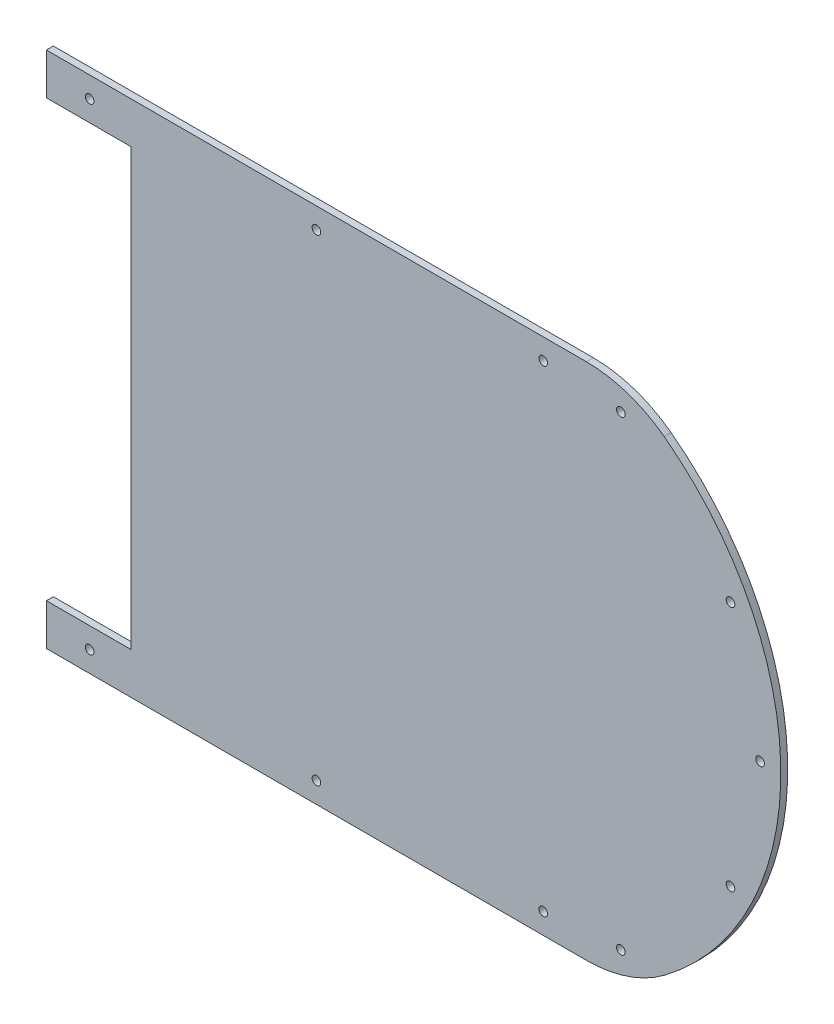
ISO-10303-21;
HEADER;
FILE_DESCRIPTION(('STEP AP214'),'2;1');
FILE_NAME('part.step','',(''),(''),'','','');
FILE_SCHEMA(('AUTOMOTIVE_DESIGN { 1 0 10303 214 1 1 1 1 }'));
ENDSEC;
DATA;
#1=APPLICATION_CONTEXT('core data for automotive mechanical design processes');
#2=APPLICATION_PROTOCOL_DEFINITION('international standard','automotive_design',2000,#1);
#3=PRODUCT_CONTEXT('',#1,'mechanical');
#4=PRODUCT('Part','Part','',(#3));
#5=PRODUCT_RELATED_PRODUCT_CATEGORY('part','',(#4));
#6=PRODUCT_DEFINITION_FORMATION('','',#4);
#7=PRODUCT_DEFINITION_CONTEXT('part definition',#1,'design');
#8=PRODUCT_DEFINITION('design','',#6,#7);
#9=PRODUCT_DEFINITION_SHAPE('','',#8);
#10=(LENGTH_UNIT() NAMED_UNIT(*) SI_UNIT(.MILLI.,.METRE.));
#11=(NAMED_UNIT(*) PLANE_ANGLE_UNIT() SI_UNIT($,.RADIAN.));
#12=(NAMED_UNIT(*) SI_UNIT($,.STERADIAN.) SOLID_ANGLE_UNIT());
#13=UNCERTAINTY_MEASURE_WITH_UNIT(LENGTH_MEASURE(1.E-05),#10,'distance_accuracy_value','');
#14=(GEOMETRIC_REPRESENTATION_CONTEXT(3) GLOBAL_UNCERTAINTY_ASSIGNED_CONTEXT((#13)) GLOBAL_UNIT_ASSIGNED_CONTEXT((#10,
#11,#12)) REPRESENTATION_CONTEXT('',''));
#15=CARTESIAN_POINT('',(0.,0.,0.));
#16=DIRECTION('',(0.,0.,1.));
#17=DIRECTION('',(1.,0.,0.));
#18=AXIS2_PLACEMENT_3D('',#15,#16,#17);
#19=CARTESIAN_POINT('',(312.5,102.525252525253,4.));
#20=DIRECTION('',(0.,0.,1.));
#21=DIRECTION('',(1.,0.,0.));
#22=AXIS2_PLACEMENT_3D('',#19,#20,#21);
#23=PLANE('',#22);
#24=CARTESIAN_POINT('',(156.25,-110.474747474747,4.));
#25=DIRECTION('',(0.,0.,1.));
#26=DIRECTION('',(1.,0.,0.));
#27=AXIS2_PLACEMENT_3D('',#24,#25,#26);
#28=CIRCLE('',#27,2.5);
#29=CARTESIAN_POINT('',(158.75,-110.474747474747,4.));
#30=VERTEX_POINT('',#29);
#31=EDGE_CURVE('E261',#30,#30,#28,.T.);
#32=ORIENTED_EDGE('',*,*,#31,.F.);
#33=EDGE_LOOP('',(#32));
#34=FACE_BOUND('',#33,.T.);
#35=CARTESIAN_POINT('',(332.422349259061,-107.24179525193,4.));
#36=DIRECTION('',(0.,0.,1.));
#37=DIRECTION('',(1.,0.,0.));
#38=AXIS2_PLACEMENT_3D('',#35,#36,#37);
#39=CIRCLE('',#38,2.50000000000002);
#40=CARTESIAN_POINT('',(334.922349259061,-107.24179525193,4.));
#41=VERTEX_POINT('',#40);
#42=EDGE_CURVE('E249',#41,#41,#39,.T.);
#43=ORIENTED_EDGE('',*,*,#42,.F.);
#44=EDGE_LOOP('',(#43));
#45=FACE_BOUND('',#44,.T.);
#46=CARTESIAN_POINT('',(395.887987253219,-43.6912835872944,4.));
#47=DIRECTION('',(0.,0.,1.));
#48=DIRECTION('',(1.,0.,0.));
#49=AXIS2_PLACEMENT_3D('',#46,#47,#48);
#50=CIRCLE('',#49,2.50000000000002);
#51=CARTESIAN_POINT('',(398.387987253219,-43.6912835872944,4.));
#52=VERTEX_POINT('',#51);
#53=EDGE_CURVE('E237',#52,#52,#50,.T.);
#54=ORIENTED_EDGE('',*,*,#53,.F.);
#55=EDGE_LOOP('',(#54));
#56=FACE_BOUND('',#55,.T.);
#57=CARTESIAN_POINT('',(395.887987253219,98.7417886377996,4.));
#58=DIRECTION('',(0.,0.,1.));
#59=DIRECTION('',(1.,0.,0.));
#60=AXIS2_PLACEMENT_3D('',#57,#58,#59);
#61=CIRCLE('',#60,2.50000000000002);
#62=CARTESIAN_POINT('',(398.387987253219,98.7417886377996,4.));
#63=VERTEX_POINT('',#62);
#64=EDGE_CURVE('E225',#63,#63,#61,.T.);
#65=ORIENTED_EDGE('',*,*,#64,.F.);
#66=EDGE_LOOP('',(#65));
#67=FACE_BOUND('',#66,.T.);
#68=CARTESIAN_POINT('',(287.5,165.525252525252,4.));
#69=DIRECTION('',(0.,0.,1.));
#70=DIRECTION('',(1.,0.,0.));
#71=AXIS2_PLACEMENT_3D('',#68,#69,#70);
#72=CIRCLE('',#71,2.50000000000002);
#73=CARTESIAN_POINT('',(290.,165.525252525252,4.));
#74=VERTEX_POINT('',#73);
#75=EDGE_CURVE('E213',#74,#74,#72,.T.);
#76=ORIENTED_EDGE('',*,*,#75,.F.);
#77=EDGE_LOOP('',(#76));
#78=FACE_BOUND('',#77,.T.);
#79=DIRECTION('',(-1.,0.,0.));
#80=VECTOR('',#79,1.);
#81=CARTESIAN_POINT('',(0.,-98.4747474747475,4.));
#82=LINE('',#81,#80);
#83=CARTESIAN_POINT('',(49.,-98.4747474747475,4.));
#84=VERTEX_POINT('',#83);
#85=CARTESIAN_POINT('',(0.,-98.4747474747475,4.));
#86=VERTEX_POINT('',#85);
#87=EDGE_CURVE('E162',#84,#86,#82,.T.);
#88=ORIENTED_EDGE('',*,*,#87,.T.);
#89=DIRECTION('',(0.,-1.,0.));
#90=VECTOR('',#89,1.);
#91=CARTESIAN_POINT('',(0.,-98.4747474747475,4.));
#92=LINE('',#91,#90);
#93=CARTESIAN_POINT('',(0.,-122.474747474747,4.));
#94=VERTEX_POINT('',#93);
#95=EDGE_CURVE('E100',#86,#94,#92,.T.);
#96=ORIENTED_EDGE('',*,*,#95,.T.);
#97=DIRECTION('',(1.,0.,0.));
#98=VECTOR('',#97,1.);
#99=CARTESIAN_POINT('',(0.,-122.474747474747,4.));
#100=LINE('',#99,#98);
#101=CARTESIAN_POINT('',(312.5,-122.474747474747,4.));
#102=VERTEX_POINT('',#101);
#103=EDGE_CURVE('E183',#94,#102,#100,.T.);
#104=ORIENTED_EDGE('',*,*,#103,.T.);
#105=CARTESIAN_POINT('',(312.5,-47.4747474747475,4.));
#106=DIRECTION('',(0.,0.,1.));
#107=DIRECTION('',(1.,0.,0.));
#108=AXIS2_PLACEMENT_3D('',#105,#106,#107);
#109=CIRCLE('',#108,75.);
#110=CARTESIAN_POINT('',(357.5,-107.474747474747,4.));
#111=VERTEX_POINT('',#110);
#112=EDGE_CURVE('E202',#102,#111,#109,.T.);
#113=ORIENTED_EDGE('',*,*,#112,.T.);
#114=CARTESIAN_POINT('',(256.25,27.5252525252525,4.));
#115=DIRECTION('',(0.,0.,1.));
#116=DIRECTION('',(1.,0.,0.));
#117=AXIS2_PLACEMENT_3D('',#114,#115,#116);
#118=CIRCLE('',#117,168.75);
#119=CARTESIAN_POINT('',(357.5,162.525252525253,4.));
#120=VERTEX_POINT('',#119);
#121=EDGE_CURVE('E199',#111,#120,#118,.T.);
#122=ORIENTED_EDGE('',*,*,#121,.T.);
#123=CARTESIAN_POINT('',(312.5,102.525252525253,4.));
#124=DIRECTION('',(0.,0.,1.));
#125=DIRECTION('',(1.,0.,0.));
#126=AXIS2_PLACEMENT_3D('',#123,#124,#125);
#127=CIRCLE('',#126,75.);
#128=CARTESIAN_POINT('',(312.5,177.525252525252,4.));
#129=VERTEX_POINT('',#128);
#130=EDGE_CURVE('E201',#120,#129,#127,.T.);
#131=ORIENTED_EDGE('',*,*,#130,.T.);
#132=DIRECTION('',(-1.,0.,0.));
#133=VECTOR('',#132,1.);
#134=CARTESIAN_POINT('',(312.5,177.525252525252,4.));
#135=LINE('',#134,#133);
#136=CARTESIAN_POINT('',(0.,177.525252525253,4.));
#137=VERTEX_POINT('',#136);
#138=EDGE_CURVE('E125',#129,#137,#135,.T.);
#139=ORIENTED_EDGE('',*,*,#138,.T.);
#140=DIRECTION('',(0.,-1.,0.));
#141=VECTOR('',#140,1.);
#142=CARTESIAN_POINT('',(0.,177.525252525253,4.));
#143=LINE('',#142,#141);
#144=CARTESIAN_POINT('',(0.,153.525252525253,4.));
#145=VERTEX_POINT('',#144);
#146=EDGE_CURVE('E119',#137,#145,#143,.T.);
#147=ORIENTED_EDGE('',*,*,#146,.T.);
#148=DIRECTION('',(1.,0.,0.));
#149=VECTOR('',#148,1.);
#150=CARTESIAN_POINT('',(49.,153.525252525253,4.));
#151=LINE('',#150,#149);
#152=CARTESIAN_POINT('',(49.,153.525252525253,4.));
#153=VERTEX_POINT('',#152);
#154=EDGE_CURVE('E123',#145,#153,#151,.T.);
#155=ORIENTED_EDGE('',*,*,#154,.T.);
#156=DIRECTION('',(0.,-1.,0.));
#157=VECTOR('',#156,1.);
#158=CARTESIAN_POINT('',(49.,153.525252525253,4.));
#159=LINE('',#158,#157);
#160=EDGE_CURVE('E51',#153,#84,#159,.T.);
#161=ORIENTED_EDGE('',*,*,#160,.T.);
#162=EDGE_LOOP('',(#88,#96,#104,#113,#122,#131,#139,#147,#155,#161));
#163=FACE_BOUND('',#162,.T.);
#164=CARTESIAN_POINT('',(156.25,165.525252525253,4.));
#165=DIRECTION('',(0.,0.,1.));
#166=DIRECTION('',(1.,0.,0.));
#167=AXIS2_PLACEMENT_3D('',#164,#165,#166);
#168=CIRCLE('',#167,2.5);
#169=CARTESIAN_POINT('',(158.75,165.525252525253,4.));
#170=VERTEX_POINT('',#169);
#171=EDGE_CURVE('E147',#170,#170,#168,.T.);
#172=ORIENTED_EDGE('',*,*,#171,.F.);
#173=EDGE_LOOP('',(#172));
#174=FACE_BOUND('',#173,.T.);
#175=CARTESIAN_POINT('',(332.422349259061,162.292300302435,4.));
#176=DIRECTION('',(0.,0.,1.));
#177=DIRECTION('',(1.,0.,0.));
#178=AXIS2_PLACEMENT_3D('',#175,#176,#177);
#179=CIRCLE('',#178,2.50000000000002);
#180=CARTESIAN_POINT('',(334.922349259061,162.292300302435,4.));
#181=VERTEX_POINT('',#180);
#182=EDGE_CURVE('E219',#181,#181,#179,.T.);
#183=ORIENTED_EDGE('',*,*,#182,.F.);
#184=EDGE_LOOP('',(#183));
#185=FACE_BOUND('',#184,.T.);
#186=CARTESIAN_POINT('',(413.,27.5252525252525,4.));
#187=DIRECTION('',(0.,0.,1.));
#188=DIRECTION('',(1.,0.,0.));
#189=AXIS2_PLACEMENT_3D('',#186,#187,#188);
#190=CIRCLE('',#189,2.50000000000002);
#191=CARTESIAN_POINT('',(415.5,27.5252525252525,4.));
#192=VERTEX_POINT('',#191);
#193=EDGE_CURVE('E231',#192,#192,#190,.T.);
#194=ORIENTED_EDGE('',*,*,#193,.F.);
#195=EDGE_LOOP('',(#194));
#196=FACE_BOUND('',#195,.T.);
#197=CARTESIAN_POINT('',(25.,165.525252525252,4.));
#198=DIRECTION('',(0.,0.,1.));
#199=DIRECTION('',(1.,0.,0.));
#200=AXIS2_PLACEMENT_3D('',#197,#198,#199);
#201=CIRCLE('',#200,2.5);
#202=CARTESIAN_POINT('',(27.5,165.525252525252,4.));
#203=VERTEX_POINT('',#202);
#204=EDGE_CURVE('E243',#203,#203,#201,.T.);
#205=ORIENTED_EDGE('',*,*,#204,.F.);
#206=EDGE_LOOP('',(#205));
#207=FACE_BOUND('',#206,.T.);
#208=CARTESIAN_POINT('',(287.5,-110.474747474747,4.));
#209=DIRECTION('',(0.,0.,1.));
#210=DIRECTION('',(1.,0.,0.));
#211=AXIS2_PLACEMENT_3D('',#208,#209,#210);
#212=CIRCLE('',#211,2.50000000000002);
#213=CARTESIAN_POINT('',(290.,-110.474747474747,4.));
#214=VERTEX_POINT('',#213);
#215=EDGE_CURVE('E255',#214,#214,#212,.T.);
#216=ORIENTED_EDGE('',*,*,#215,.F.);
#217=EDGE_LOOP('',(#216));
#218=FACE_BOUND('',#217,.T.);
#219=CARTESIAN_POINT('',(25.,-110.474747474747,4.));
#220=DIRECTION('',(0.,0.,1.));
#221=DIRECTION('',(1.,0.,0.));
#222=AXIS2_PLACEMENT_3D('',#219,#220,#221);
#223=CIRCLE('',#222,2.5);
#224=CARTESIAN_POINT('',(27.5,-110.474747474747,4.));
#225=VERTEX_POINT('',#224);
#226=EDGE_CURVE('E267',#225,#225,#223,.T.);
#227=ORIENTED_EDGE('',*,*,#226,.F.);
#228=EDGE_LOOP('',(#227));
#229=FACE_BOUND('',#228,.T.);
#230=ADVANCED_FACE('F34',(#34,#45,#56,#67,#78,#163,#174,#185,#196,#207,#218,#229),#23,.T.);
#231=CARTESIAN_POINT('',(312.5,102.525252525253,0.));
#232=DIRECTION('',(0.,0.,1.));
#233=DIRECTION('',(1.,0.,0.));
#234=AXIS2_PLACEMENT_3D('',#231,#232,#233);
#235=PLANE('',#234);
#236=DIRECTION('',(-1.,0.,0.));
#237=VECTOR('',#236,1.);
#238=CARTESIAN_POINT('',(0.,-98.4747474747475,0.));
#239=LINE('',#238,#237);
#240=CARTESIAN_POINT('',(49.,-98.4747474747475,0.));
#241=VERTEX_POINT('',#240);
#242=CARTESIAN_POINT('',(0.,-98.4747474747475,0.));
#243=VERTEX_POINT('',#242);
#244=EDGE_CURVE('E143',#241,#243,#239,.T.);
#245=ORIENTED_EDGE('',*,*,#244,.F.);
#246=DIRECTION('',(0.,-1.,0.));
#247=VECTOR('',#246,1.);
#248=CARTESIAN_POINT('',(49.,153.525252525253,0.));
#249=LINE('',#248,#247);
#250=CARTESIAN_POINT('',(49.,153.525252525253,0.));
#251=VERTEX_POINT('',#250);
#252=EDGE_CURVE('E92',#251,#241,#249,.T.);
#253=ORIENTED_EDGE('',*,*,#252,.F.);
#254=DIRECTION('',(1.,0.,0.));
#255=VECTOR('',#254,1.);
#256=CARTESIAN_POINT('',(49.,153.525252525253,0.));
#257=LINE('',#256,#255);
#258=CARTESIAN_POINT('',(0.,153.525252525253,0.));
#259=VERTEX_POINT('',#258);
#260=EDGE_CURVE('E86',#259,#251,#257,.T.);
#261=ORIENTED_EDGE('',*,*,#260,.F.);
#262=DIRECTION('',(0.,-1.,0.));
#263=VECTOR('',#262,1.);
#264=CARTESIAN_POINT('',(0.,177.525252525253,0.));
#265=LINE('',#264,#263);
#266=CARTESIAN_POINT('',(0.,177.525252525253,0.));
#267=VERTEX_POINT('',#266);
#268=EDGE_CURVE('E133',#267,#259,#265,.T.);
#269=ORIENTED_EDGE('',*,*,#268,.F.);
#270=DIRECTION('',(-1.,0.,0.));
#271=VECTOR('',#270,1.);
#272=CARTESIAN_POINT('',(312.5,177.525252525252,0.));
#273=LINE('',#272,#271);
#274=CARTESIAN_POINT('',(312.5,177.525252525252,0.));
#275=VERTEX_POINT('',#274);
#276=EDGE_CURVE('E157',#275,#267,#273,.T.);
#277=ORIENTED_EDGE('',*,*,#276,.F.);
#278=CARTESIAN_POINT('',(312.5,102.525252525253,0.));
#279=DIRECTION('',(0.,0.,1.));
#280=DIRECTION('',(1.,0.,0.));
#281=AXIS2_PLACEMENT_3D('',#278,#279,#280);
#282=CIRCLE('',#281,75.);
#283=CARTESIAN_POINT('',(357.5,162.525252525253,0.));
#284=VERTEX_POINT('',#283);
#285=EDGE_CURVE('E155',#284,#275,#282,.T.);
#286=ORIENTED_EDGE('',*,*,#285,.F.);
#287=CARTESIAN_POINT('',(256.25,27.5252525252525,0.));
#288=DIRECTION('',(0.,0.,1.));
#289=DIRECTION('',(1.,0.,0.));
#290=AXIS2_PLACEMENT_3D('',#287,#288,#289);
#291=CIRCLE('',#290,168.75);
#292=CARTESIAN_POINT('',(357.5,-107.474747474747,0.));
#293=VERTEX_POINT('',#292);
#294=EDGE_CURVE('E153',#293,#284,#291,.T.);
#295=ORIENTED_EDGE('',*,*,#294,.F.);
#296=CARTESIAN_POINT('',(312.5,-47.4747474747475,0.));
#297=DIRECTION('',(0.,0.,1.));
#298=DIRECTION('',(1.,0.,0.));
#299=AXIS2_PLACEMENT_3D('',#296,#297,#298);
#300=CIRCLE('',#299,75.);
#301=CARTESIAN_POINT('',(312.5,-122.474747474747,0.));
#302=VERTEX_POINT('',#301);
#303=EDGE_CURVE('E151',#302,#293,#300,.T.);
#304=ORIENTED_EDGE('',*,*,#303,.F.);
#305=DIRECTION('',(1.,0.,0.));
#306=VECTOR('',#305,1.);
#307=CARTESIAN_POINT('',(0.,-122.474747474747,0.));
#308=LINE('',#307,#306);
#309=CARTESIAN_POINT('',(0.,-122.474747474747,0.));
#310=VERTEX_POINT('',#309);
#311=EDGE_CURVE('E149',#310,#302,#308,.T.);
#312=ORIENTED_EDGE('',*,*,#311,.F.);
#313=DIRECTION('',(0.,-1.,0.));
#314=VECTOR('',#313,1.);
#315=CARTESIAN_POINT('',(0.,-98.4747474747475,0.));
#316=LINE('',#315,#314);
#317=EDGE_CURVE('E146',#243,#310,#316,.T.);
#318=ORIENTED_EDGE('',*,*,#317,.F.);
#319=EDGE_LOOP('',(#245,#253,#261,#269,#277,#286,#295,#304,#312,#318));
#320=FACE_BOUND('',#319,.T.);
#321=CARTESIAN_POINT('',(156.25,165.525252525253,0.));
#322=DIRECTION('',(0.,0.,1.));
#323=DIRECTION('',(1.,0.,0.));
#324=AXIS2_PLACEMENT_3D('',#321,#322,#323);
#325=CIRCLE('',#324,2.5);
#326=CARTESIAN_POINT('',(158.75,165.525252525253,0.));
#327=VERTEX_POINT('',#326);
#328=EDGE_CURVE('E210',#327,#327,#325,.T.);
#329=ORIENTED_EDGE('',*,*,#328,.T.);
#330=EDGE_LOOP('',(#329));
#331=FACE_BOUND('',#330,.T.);
#332=CARTESIAN_POINT('',(287.5,165.525252525252,0.));
#333=DIRECTION('',(0.,0.,1.));
#334=DIRECTION('',(1.,0.,0.));
#335=AXIS2_PLACEMENT_3D('',#332,#333,#334);
#336=CIRCLE('',#335,2.50000000000002);
#337=CARTESIAN_POINT('',(290.,165.525252525252,0.));
#338=VERTEX_POINT('',#337);
#339=EDGE_CURVE('E216',#338,#338,#336,.T.);
#340=ORIENTED_EDGE('',*,*,#339,.T.);
#341=EDGE_LOOP('',(#340));
#342=FACE_BOUND('',#341,.T.);
#343=CARTESIAN_POINT('',(332.422349259061,162.292300302435,0.));
#344=DIRECTION('',(0.,0.,1.));
#345=DIRECTION('',(1.,0.,0.));
#346=AXIS2_PLACEMENT_3D('',#343,#344,#345);
#347=CIRCLE('',#346,2.50000000000002);
#348=CARTESIAN_POINT('',(334.922349259061,162.292300302435,0.));
#349=VERTEX_POINT('',#348);
#350=EDGE_CURVE('E222',#349,#349,#347,.T.);
#351=ORIENTED_EDGE('',*,*,#350,.T.);
#352=EDGE_LOOP('',(#351));
#353=FACE_BOUND('',#352,.T.);
#354=CARTESIAN_POINT('',(395.887987253219,98.7417886377996,0.));
#355=DIRECTION('',(0.,0.,1.));
#356=DIRECTION('',(1.,0.,0.));
#357=AXIS2_PLACEMENT_3D('',#354,#355,#356);
#358=CIRCLE('',#357,2.50000000000002);
#359=CARTESIAN_POINT('',(398.387987253219,98.7417886377996,0.));
#360=VERTEX_POINT('',#359);
#361=EDGE_CURVE('E228',#360,#360,#358,.T.);
#362=ORIENTED_EDGE('',*,*,#361,.T.);
#363=EDGE_LOOP('',(#362));
#364=FACE_BOUND('',#363,.T.);
#365=CARTESIAN_POINT('',(413.,27.5252525252525,0.));
#366=DIRECTION('',(0.,0.,1.));
#367=DIRECTION('',(1.,0.,0.));
#368=AXIS2_PLACEMENT_3D('',#365,#366,#367);
#369=CIRCLE('',#368,2.50000000000002);
#370=CARTESIAN_POINT('',(415.5,27.5252525252525,0.));
#371=VERTEX_POINT('',#370);
#372=EDGE_CURVE('E234',#371,#371,#369,.T.);
#373=ORIENTED_EDGE('',*,*,#372,.T.);
#374=EDGE_LOOP('',(#373));
#375=FACE_BOUND('',#374,.T.);
#376=CARTESIAN_POINT('',(395.887987253219,-43.6912835872944,0.));
#377=DIRECTION('',(0.,0.,1.));
#378=DIRECTION('',(1.,0.,0.));
#379=AXIS2_PLACEMENT_3D('',#376,#377,#378);
#380=CIRCLE('',#379,2.50000000000002);
#381=CARTESIAN_POINT('',(398.387987253219,-43.6912835872944,0.));
#382=VERTEX_POINT('',#381);
#383=EDGE_CURVE('E240',#382,#382,#380,.T.);
#384=ORIENTED_EDGE('',*,*,#383,.T.);
#385=EDGE_LOOP('',(#384));
#386=FACE_BOUND('',#385,.T.);
#387=CARTESIAN_POINT('',(25.,165.525252525252,0.));
#388=DIRECTION('',(0.,0.,1.));
#389=DIRECTION('',(1.,0.,0.));
#390=AXIS2_PLACEMENT_3D('',#387,#388,#389);
#391=CIRCLE('',#390,2.5);
#392=CARTESIAN_POINT('',(27.5,165.525252525252,0.));
#393=VERTEX_POINT('',#392);
#394=EDGE_CURVE('E246',#393,#393,#391,.T.);
#395=ORIENTED_EDGE('',*,*,#394,.T.);
#396=EDGE_LOOP('',(#395));
#397=FACE_BOUND('',#396,.T.);
#398=CARTESIAN_POINT('',(332.422349259061,-107.24179525193,0.));
#399=DIRECTION('',(0.,0.,1.));
#400=DIRECTION('',(1.,0.,0.));
#401=AXIS2_PLACEMENT_3D('',#398,#399,#400);
#402=CIRCLE('',#401,2.50000000000002);
#403=CARTESIAN_POINT('',(334.922349259061,-107.24179525193,0.));
#404=VERTEX_POINT('',#403);
#405=EDGE_CURVE('E252',#404,#404,#402,.T.);
#406=ORIENTED_EDGE('',*,*,#405,.T.);
#407=EDGE_LOOP('',(#406));
#408=FACE_BOUND('',#407,.T.);
#409=CARTESIAN_POINT('',(287.5,-110.474747474747,0.));
#410=DIRECTION('',(0.,0.,1.));
#411=DIRECTION('',(1.,0.,0.));
#412=AXIS2_PLACEMENT_3D('',#409,#410,#411);
#413=CIRCLE('',#412,2.50000000000002);
#414=CARTESIAN_POINT('',(290.,-110.474747474747,0.));
#415=VERTEX_POINT('',#414);
#416=EDGE_CURVE('E258',#415,#415,#413,.T.);
#417=ORIENTED_EDGE('',*,*,#416,.T.);
#418=EDGE_LOOP('',(#417));
#419=FACE_BOUND('',#418,.T.);
#420=CARTESIAN_POINT('',(156.25,-110.474747474747,0.));
#421=DIRECTION('',(0.,0.,1.));
#422=DIRECTION('',(1.,0.,0.));
#423=AXIS2_PLACEMENT_3D('',#420,#421,#422);
#424=CIRCLE('',#423,2.5);
#425=CARTESIAN_POINT('',(158.75,-110.474747474747,0.));
#426=VERTEX_POINT('',#425);
#427=EDGE_CURVE('E264',#426,#426,#424,.T.);
#428=ORIENTED_EDGE('',*,*,#427,.T.);
#429=EDGE_LOOP('',(#428));
#430=FACE_BOUND('',#429,.T.);
#431=CARTESIAN_POINT('',(25.,-110.474747474747,0.));
#432=DIRECTION('',(0.,0.,1.));
#433=DIRECTION('',(1.,0.,0.));
#434=AXIS2_PLACEMENT_3D('',#431,#432,#433);
#435=CIRCLE('',#434,2.5);
#436=CARTESIAN_POINT('',(27.5,-110.474747474747,0.));
#437=VERTEX_POINT('',#436);
#438=EDGE_CURVE('E270',#437,#437,#435,.T.);
#439=ORIENTED_EDGE('',*,*,#438,.T.);
#440=EDGE_LOOP('',(#439));
#441=FACE_BOUND('',#440,.T.);
#442=ADVANCED_FACE('F187',(#320,#331,#342,#353,#364,#375,#386,#397,#408,#419,#430,#441),#235,.F.);
#443=CARTESIAN_POINT('',(0.,-98.4747474747475,4.));
#444=DIRECTION('',(0.,-1.,0.));
#445=DIRECTION('',(0.,0.,-1.));
#446=AXIS2_PLACEMENT_3D('',#443,#444,#445);
#447=PLANE('',#446);
#448=ORIENTED_EDGE('',*,*,#244,.T.);
#449=DIRECTION('',(0.,0.,-1.));
#450=VECTOR('',#449,1.);
#451=CARTESIAN_POINT('',(0.,-98.4747474747475,4.));
#452=LINE('',#451,#450);
#453=EDGE_CURVE('E11',#86,#243,#452,.T.);
#454=ORIENTED_EDGE('',*,*,#453,.F.);
#455=ORIENTED_EDGE('',*,*,#87,.F.);
#456=DIRECTION('',(0.,0.,-1.));
#457=VECTOR('',#456,1.);
#458=CARTESIAN_POINT('',(49.,-98.4747474747475,4.));
#459=LINE('',#458,#457);
#460=EDGE_CURVE('E139',#84,#241,#459,.T.);
#461=ORIENTED_EDGE('',*,*,#460,.T.);
#462=EDGE_LOOP('',(#448,#454,#455,#461));
#463=FACE_BOUND('',#462,.T.);
#464=ADVANCED_FACE('F36',(#463),#447,.F.);
#465=CARTESIAN_POINT('',(0.,-98.4747474747475,4.));
#466=DIRECTION('',(1.,0.,0.));
#467=DIRECTION('',(0.,1.,0.));
#468=AXIS2_PLACEMENT_3D('',#465,#466,#467);
#469=PLANE('',#468);
#470=ORIENTED_EDGE('',*,*,#317,.T.);
#471=DIRECTION('',(0.,0.,-1.));
#472=VECTOR('',#471,1.);
#473=CARTESIAN_POINT('',(0.,-122.474747474747,4.));
#474=LINE('',#473,#472);
#475=EDGE_CURVE('E43',#94,#310,#474,.T.);
#476=ORIENTED_EDGE('',*,*,#475,.F.);
#477=ORIENTED_EDGE('',*,*,#95,.F.);
#478=ORIENTED_EDGE('',*,*,#453,.T.);
#479=EDGE_LOOP('',(#470,#476,#477,#478));
#480=FACE_BOUND('',#479,.T.);
#481=ADVANCED_FACE('F312',(#480),#469,.F.);
#482=CARTESIAN_POINT('',(0.,-122.474747474747,4.));
#483=DIRECTION('',(0.,1.,0.));
#484=DIRECTION('',(-1.,0.,0.));
#485=AXIS2_PLACEMENT_3D('',#482,#483,#484);
#486=PLANE('',#485);
#487=ORIENTED_EDGE('',*,*,#311,.T.);
#488=DIRECTION('',(0.,0.,-1.));
#489=VECTOR('',#488,1.);
#490=CARTESIAN_POINT('',(312.5,-122.474747474747,4.));
#491=LINE('',#490,#489);
#492=EDGE_CURVE('E175',#102,#302,#491,.T.);
#493=ORIENTED_EDGE('',*,*,#492,.F.);
#494=ORIENTED_EDGE('',*,*,#103,.F.);
#495=ORIENTED_EDGE('',*,*,#475,.T.);
#496=EDGE_LOOP('',(#487,#493,#494,#495));
#497=FACE_BOUND('',#496,.T.);
#498=ADVANCED_FACE('F181',(#497),#486,.F.);
#499=CARTESIAN_POINT('',(312.5,-47.4747474747475,4.));
#500=DIRECTION('',(0.,0.,-1.));
#501=DIRECTION('',(-1.,0.,0.));
#502=AXIS2_PLACEMENT_3D('',#499,#500,#501);
#503=CYLINDRICAL_SURFACE('',#502,75.);
#504=ORIENTED_EDGE('',*,*,#303,.T.);
#505=DIRECTION('',(0.,0.,-1.));
#506=VECTOR('',#505,1.);
#507=CARTESIAN_POINT('',(357.5,-107.474747474747,4.));
#508=LINE('',#507,#506);
#509=EDGE_CURVE('E172',#111,#293,#508,.T.);
#510=ORIENTED_EDGE('',*,*,#509,.F.);
#511=ORIENTED_EDGE('',*,*,#112,.F.);
#512=ORIENTED_EDGE('',*,*,#492,.T.);
#513=EDGE_LOOP('',(#504,#510,#511,#512));
#514=FACE_BOUND('',#513,.T.);
#515=ADVANCED_FACE('F193',(#514),#503,.T.);
#516=CARTESIAN_POINT('',(256.25,27.5252525252525,4.));
#517=DIRECTION('',(0.,0.,-1.));
#518=DIRECTION('',(-1.,0.,0.));
#519=AXIS2_PLACEMENT_3D('',#516,#517,#518);
#520=CYLINDRICAL_SURFACE('',#519,168.75);
#521=ORIENTED_EDGE('',*,*,#294,.T.);
#522=DIRECTION('',(0.,0.,-1.));
#523=VECTOR('',#522,1.);
#524=CARTESIAN_POINT('',(357.5,162.525252525253,4.));
#525=LINE('',#524,#523);
#526=EDGE_CURVE('E169',#120,#284,#525,.T.);
#527=ORIENTED_EDGE('',*,*,#526,.F.);
#528=ORIENTED_EDGE('',*,*,#121,.F.);
#529=ORIENTED_EDGE('',*,*,#509,.T.);
#530=EDGE_LOOP('',(#521,#527,#528,#529));
#531=FACE_BOUND('',#530,.T.);
#532=ADVANCED_FACE('F197',(#531),#520,.T.);
#533=CARTESIAN_POINT('',(312.5,102.525252525253,4.));
#534=DIRECTION('',(0.,0.,-1.));
#535=DIRECTION('',(-1.,0.,0.));
#536=AXIS2_PLACEMENT_3D('',#533,#534,#535);
#537=CYLINDRICAL_SURFACE('',#536,75.);
#538=ORIENTED_EDGE('',*,*,#285,.T.);
#539=DIRECTION('',(0.,0.,-1.));
#540=VECTOR('',#539,1.);
#541=CARTESIAN_POINT('',(312.5,177.525252525252,4.));
#542=LINE('',#541,#540);
#543=EDGE_CURVE('E166',#129,#275,#542,.T.);
#544=ORIENTED_EDGE('',*,*,#543,.F.);
#545=ORIENTED_EDGE('',*,*,#130,.F.);
#546=ORIENTED_EDGE('',*,*,#526,.T.);
#547=EDGE_LOOP('',(#538,#544,#545,#546));
#548=FACE_BOUND('',#547,.T.);
#549=ADVANCED_FACE('F302',(#548),#537,.T.);
#550=CARTESIAN_POINT('',(312.5,177.525252525252,4.));
#551=DIRECTION('',(0.,-1.,0.));
#552=DIRECTION('',(1.,0.,0.));
#553=AXIS2_PLACEMENT_3D('',#550,#551,#552);
#554=PLANE('',#553);
#555=ORIENTED_EDGE('',*,*,#276,.T.);
#556=DIRECTION('',(0.,0.,-1.));
#557=VECTOR('',#556,1.);
#558=CARTESIAN_POINT('',(0.,177.525252525253,4.));
#559=LINE('',#558,#557);
#560=EDGE_CURVE('E134',#137,#267,#559,.T.);
#561=ORIENTED_EDGE('',*,*,#560,.F.);
#562=ORIENTED_EDGE('',*,*,#138,.F.);
#563=ORIENTED_EDGE('',*,*,#543,.T.);
#564=EDGE_LOOP('',(#555,#561,#562,#563));
#565=FACE_BOUND('',#564,.T.);
#566=ADVANCED_FACE('F299',(#565),#554,.F.);
#567=CARTESIAN_POINT('',(0.,177.525252525253,4.));
#568=DIRECTION('',(1.,0.,0.));
#569=DIRECTION('',(0.,0.,-1.));
#570=AXIS2_PLACEMENT_3D('',#567,#568,#569);
#571=PLANE('',#570);
#572=ORIENTED_EDGE('',*,*,#268,.T.);
#573=DIRECTION('',(0.,0.,-1.));
#574=VECTOR('',#573,1.);
#575=CARTESIAN_POINT('',(0.,153.525252525253,4.));
#576=LINE('',#575,#574);
#577=EDGE_CURVE('E130',#145,#259,#576,.T.);
#578=ORIENTED_EDGE('',*,*,#577,.F.);
#579=ORIENTED_EDGE('',*,*,#146,.F.);
#580=ORIENTED_EDGE('',*,*,#560,.T.);
#581=EDGE_LOOP('',(#572,#578,#579,#580));
#582=FACE_BOUND('',#581,.T.);
#583=ADVANCED_FACE('F131',(#582),#571,.F.);
#584=CARTESIAN_POINT('',(49.,153.525252525253,4.));
#585=DIRECTION('',(0.,1.,0.));
#586=DIRECTION('',(0.,0.,1.));
#587=AXIS2_PLACEMENT_3D('',#584,#585,#586);
#588=PLANE('',#587);
#589=ORIENTED_EDGE('',*,*,#260,.T.);
#590=DIRECTION('',(0.,0.,-1.));
#591=VECTOR('',#590,1.);
#592=CARTESIAN_POINT('',(49.,153.525252525253,4.));
#593=LINE('',#592,#591);
#594=EDGE_CURVE('E135',#153,#251,#593,.T.);
#595=ORIENTED_EDGE('',*,*,#594,.F.);
#596=ORIENTED_EDGE('',*,*,#154,.F.);
#597=ORIENTED_EDGE('',*,*,#577,.T.);
#598=EDGE_LOOP('',(#589,#595,#596,#597));
#599=FACE_BOUND('',#598,.T.);
#600=ADVANCED_FACE('F137',(#599),#588,.F.);
#601=CARTESIAN_POINT('',(49.,153.525252525253,4.));
#602=DIRECTION('',(1.,0.,0.));
#603=DIRECTION('',(0.,1.,0.));
#604=AXIS2_PLACEMENT_3D('',#601,#602,#603);
#605=PLANE('',#604);
#606=ORIENTED_EDGE('',*,*,#252,.T.);
#607=ORIENTED_EDGE('',*,*,#460,.F.);
#608=ORIENTED_EDGE('',*,*,#160,.F.);
#609=ORIENTED_EDGE('',*,*,#594,.T.);
#610=EDGE_LOOP('',(#606,#607,#608,#609));
#611=FACE_BOUND('',#610,.T.);
#612=ADVANCED_FACE('F292',(#611),#605,.F.);
#613=CARTESIAN_POINT('',(156.25,165.525252525253,4.));
#614=DIRECTION('',(0.,0.,-1.));
#615=DIRECTION('',(-1.,0.,0.));
#616=AXIS2_PLACEMENT_3D('',#613,#614,#615);
#617=CYLINDRICAL_SURFACE('',#616,2.5);
#618=ORIENTED_EDGE('',*,*,#171,.T.);
#619=EDGE_LOOP('',(#618));
#620=FACE_BOUND('',#619,.T.);
#621=ORIENTED_EDGE('',*,*,#328,.F.);
#622=EDGE_LOOP('',(#621));
#623=FACE_BOUND('',#622,.T.);
#624=ADVANCED_FACE('F289',(#620,#623),#617,.F.);
#625=CARTESIAN_POINT('',(287.5,165.525252525252,4.));
#626=DIRECTION('',(0.,0.,-1.));
#627=DIRECTION('',(-1.,0.,0.));
#628=AXIS2_PLACEMENT_3D('',#625,#626,#627);
#629=CYLINDRICAL_SURFACE('',#628,2.50000000000002);
#630=ORIENTED_EDGE('',*,*,#75,.T.);
#631=EDGE_LOOP('',(#630));
#632=FACE_BOUND('',#631,.T.);
#633=ORIENTED_EDGE('',*,*,#339,.F.);
#634=EDGE_LOOP('',(#633));
#635=FACE_BOUND('',#634,.T.);
#636=ADVANCED_FACE('F390',(#632,#635),#629,.F.);
#637=CARTESIAN_POINT('',(332.422349259061,162.292300302435,4.));
#638=DIRECTION('',(0.,0.,-1.));
#639=DIRECTION('',(-1.,0.,0.));
#640=AXIS2_PLACEMENT_3D('',#637,#638,#639);
#641=CYLINDRICAL_SURFACE('',#640,2.50000000000002);
#642=ORIENTED_EDGE('',*,*,#182,.T.);
#643=EDGE_LOOP('',(#642));
#644=FACE_BOUND('',#643,.T.);
#645=ORIENTED_EDGE('',*,*,#350,.F.);
#646=EDGE_LOOP('',(#645));
#647=FACE_BOUND('',#646,.T.);
#648=ADVANCED_FACE('F398',(#644,#647),#641,.F.);
#649=CARTESIAN_POINT('',(395.887987253219,98.7417886377996,4.));
#650=DIRECTION('',(0.,0.,-1.));
#651=DIRECTION('',(-1.,0.,0.));
#652=AXIS2_PLACEMENT_3D('',#649,#650,#651);
#653=CYLINDRICAL_SURFACE('',#652,2.50000000000002);
#654=ORIENTED_EDGE('',*,*,#64,.T.);
#655=EDGE_LOOP('',(#654));
#656=FACE_BOUND('',#655,.T.);
#657=ORIENTED_EDGE('',*,*,#361,.F.);
#658=EDGE_LOOP('',(#657));
#659=FACE_BOUND('',#658,.T.);
#660=ADVANCED_FACE('F406',(#656,#659),#653,.F.);
#661=CARTESIAN_POINT('',(413.,27.5252525252525,4.));
#662=DIRECTION('',(0.,0.,-1.));
#663=DIRECTION('',(-1.,0.,0.));
#664=AXIS2_PLACEMENT_3D('',#661,#662,#663);
#665=CYLINDRICAL_SURFACE('',#664,2.50000000000002);
#666=ORIENTED_EDGE('',*,*,#193,.T.);
#667=EDGE_LOOP('',(#666));
#668=FACE_BOUND('',#667,.T.);
#669=ORIENTED_EDGE('',*,*,#372,.F.);
#670=EDGE_LOOP('',(#669));
#671=FACE_BOUND('',#670,.T.);
#672=ADVANCED_FACE('F415',(#668,#671),#665,.F.);
#673=CARTESIAN_POINT('',(395.887987253219,-43.6912835872944,4.));
#674=DIRECTION('',(0.,0.,-1.));
#675=DIRECTION('',(-1.,0.,0.));
#676=AXIS2_PLACEMENT_3D('',#673,#674,#675);
#677=CYLINDRICAL_SURFACE('',#676,2.50000000000002);
#678=ORIENTED_EDGE('',*,*,#53,.T.);
#679=EDGE_LOOP('',(#678));
#680=FACE_BOUND('',#679,.T.);
#681=ORIENTED_EDGE('',*,*,#383,.F.);
#682=EDGE_LOOP('',(#681));
#683=FACE_BOUND('',#682,.T.);
#684=ADVANCED_FACE('F424',(#680,#683),#677,.F.);
#685=CARTESIAN_POINT('',(25.,165.525252525252,4.));
#686=DIRECTION('',(0.,0.,-1.));
#687=DIRECTION('',(-1.,0.,0.));
#688=AXIS2_PLACEMENT_3D('',#685,#686,#687);
#689=CYLINDRICAL_SURFACE('',#688,2.5);
#690=ORIENTED_EDGE('',*,*,#204,.T.);
#691=EDGE_LOOP('',(#690));
#692=FACE_BOUND('',#691,.T.);
#693=ORIENTED_EDGE('',*,*,#394,.F.);
#694=EDGE_LOOP('',(#693));
#695=FACE_BOUND('',#694,.T.);
#696=ADVANCED_FACE('F433',(#692,#695),#689,.F.);
#697=CARTESIAN_POINT('',(332.422349259061,-107.24179525193,4.));
#698=DIRECTION('',(0.,0.,-1.));
#699=DIRECTION('',(-1.,0.,0.));
#700=AXIS2_PLACEMENT_3D('',#697,#698,#699);
#701=CYLINDRICAL_SURFACE('',#700,2.50000000000002);
#702=ORIENTED_EDGE('',*,*,#42,.T.);
#703=EDGE_LOOP('',(#702));
#704=FACE_BOUND('',#703,.T.);
#705=ORIENTED_EDGE('',*,*,#405,.F.);
#706=EDGE_LOOP('',(#705));
#707=FACE_BOUND('',#706,.T.);
#708=ADVANCED_FACE('F442',(#704,#707),#701,.F.);
#709=CARTESIAN_POINT('',(287.5,-110.474747474747,4.));
#710=DIRECTION('',(0.,0.,-1.));
#711=DIRECTION('',(-1.,0.,0.));
#712=AXIS2_PLACEMENT_3D('',#709,#710,#711);
#713=CYLINDRICAL_SURFACE('',#712,2.50000000000002);
#714=ORIENTED_EDGE('',*,*,#215,.T.);
#715=EDGE_LOOP('',(#714));
#716=FACE_BOUND('',#715,.T.);
#717=ORIENTED_EDGE('',*,*,#416,.F.);
#718=EDGE_LOOP('',(#717));
#719=FACE_BOUND('',#718,.T.);
#720=ADVANCED_FACE('F451',(#716,#719),#713,.F.);
#721=CARTESIAN_POINT('',(156.25,-110.474747474747,4.));
#722=DIRECTION('',(0.,0.,-1.));
#723=DIRECTION('',(-1.,0.,0.));
#724=AXIS2_PLACEMENT_3D('',#721,#722,#723);
#725=CYLINDRICAL_SURFACE('',#724,2.5);
#726=ORIENTED_EDGE('',*,*,#31,.T.);
#727=EDGE_LOOP('',(#726));
#728=FACE_BOUND('',#727,.T.);
#729=ORIENTED_EDGE('',*,*,#427,.F.);
#730=EDGE_LOOP('',(#729));
#731=FACE_BOUND('',#730,.T.);
#732=ADVANCED_FACE('F460',(#728,#731),#725,.F.);
#733=CARTESIAN_POINT('',(25.,-110.474747474747,4.));
#734=DIRECTION('',(0.,0.,-1.));
#735=DIRECTION('',(-1.,0.,0.));
#736=AXIS2_PLACEMENT_3D('',#733,#734,#735);
#737=CYLINDRICAL_SURFACE('',#736,2.5);
#738=ORIENTED_EDGE('',*,*,#226,.T.);
#739=EDGE_LOOP('',(#738));
#740=FACE_BOUND('',#739,.T.);
#741=ORIENTED_EDGE('',*,*,#438,.F.);
#742=EDGE_LOOP('',(#741));
#743=FACE_BOUND('',#742,.T.);
#744=ADVANCED_FACE('F276',(#740,#743),#737,.F.);
#745=CLOSED_SHELL('',(#230,#442,#464,#481,#498,#515,#532,#549,#566,#583,#600,#612,#624,#636,
#648,#660,#672,#684,#696,#708,#720,#732,#744));
#746=MANIFOLD_SOLID_BREP('B2',#745);
#747=ADVANCED_BREP_SHAPE_REPRESENTATION('',(#18,#746),#14);
#748=SHAPE_DEFINITION_REPRESENTATION(#9,#747);
ENDSEC;
END-ISO-10303-21;
